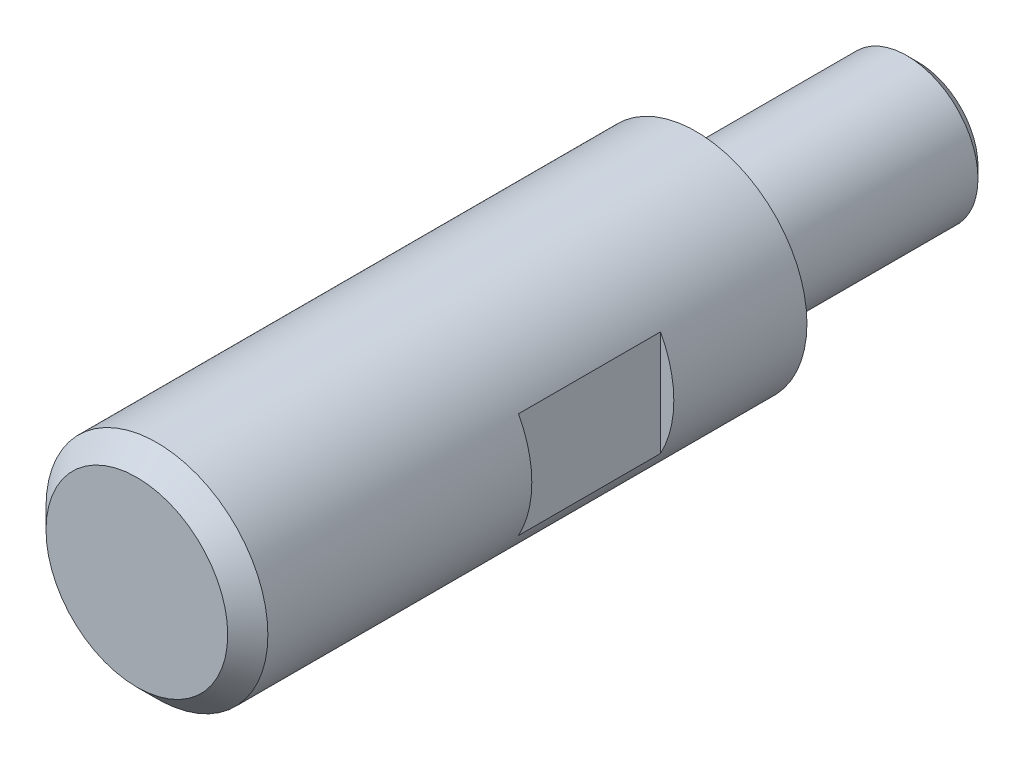
ISO-10303-21;
HEADER;
FILE_DESCRIPTION(('STEP AP214'),'2;1');
FILE_NAME('part.step','',(''),(''),'','','');
FILE_SCHEMA(('AUTOMOTIVE_DESIGN { 1 0 10303 214 1 1 1 1 }'));
ENDSEC;
DATA;
#1=APPLICATION_CONTEXT('core data for automotive mechanical design processes');
#2=APPLICATION_PROTOCOL_DEFINITION('international standard','automotive_design',2000,#1);
#3=PRODUCT_CONTEXT('',#1,'mechanical');
#4=PRODUCT('Part','Part','',(#3));
#5=PRODUCT_RELATED_PRODUCT_CATEGORY('part','',(#4));
#6=PRODUCT_DEFINITION_FORMATION('','',#4);
#7=PRODUCT_DEFINITION_CONTEXT('part definition',#1,'design');
#8=PRODUCT_DEFINITION('design','',#6,#7);
#9=PRODUCT_DEFINITION_SHAPE('','',#8);
#10=(LENGTH_UNIT() NAMED_UNIT(*) SI_UNIT(.MILLI.,.METRE.));
#11=(NAMED_UNIT(*) PLANE_ANGLE_UNIT() SI_UNIT($,.RADIAN.));
#12=(NAMED_UNIT(*) SI_UNIT($,.STERADIAN.) SOLID_ANGLE_UNIT());
#13=UNCERTAINTY_MEASURE_WITH_UNIT(LENGTH_MEASURE(1.E-05),#10,'distance_accuracy_value','');
#14=(GEOMETRIC_REPRESENTATION_CONTEXT(3) GLOBAL_UNCERTAINTY_ASSIGNED_CONTEXT((#13)) GLOBAL_UNIT_ASSIGNED_CONTEXT((#10,
#11,#12)) REPRESENTATION_CONTEXT('',''));
#15=CARTESIAN_POINT('',(0.,0.,0.));
#16=DIRECTION('',(0.,0.,1.));
#17=DIRECTION('',(1.,0.,0.));
#18=AXIS2_PLACEMENT_3D('',#15,#16,#17);
#19=CARTESIAN_POINT('',(0.,0.,25.));
#20=DIRECTION('',(0.,0.,1.));
#21=DIRECTION('',(1.,0.,0.));
#22=AXIS2_PLACEMENT_3D('',#19,#20,#21);
#23=CYLINDRICAL_SURFACE('',#22,12.5);
#24=DIRECTION('',(0.,0.,1.));
#25=VECTOR('',#24,1.);
#26=CARTESIAN_POINT('',(-11.,-5.9371710435184,25.));
#27=LINE('',#26,#25);
#28=CARTESIAN_POINT('',(-11.,-5.9371710435184,56.));
#29=VERTEX_POINT('',#28);
#30=CARTESIAN_POINT('',(-11.,-5.9371710435184,40.));
#31=VERTEX_POINT('',#30);
#32=EDGE_CURVE('E94',#29,#31,#27,.F.);
#33=ORIENTED_EDGE('',*,*,#32,.T.);
#34=CARTESIAN_POINT('',(0.,0.,40.));
#35=DIRECTION('',(0.,0.,-1.));
#36=DIRECTION('',(-1.,0.,0.));
#37=AXIS2_PLACEMENT_3D('',#34,#35,#36);
#38=CIRCLE('',#37,12.5);
#39=CARTESIAN_POINT('',(-10.9999999999987,5.93717104351957,40.));
#40=VERTEX_POINT('',#39);
#41=EDGE_CURVE('E13',#31,#40,#38,.T.);
#42=ORIENTED_EDGE('',*,*,#41,.T.);
#43=DIRECTION('',(0.,0.,1.));
#44=VECTOR('',#43,1.);
#45=CARTESIAN_POINT('',(-10.9999999999987,5.93717104351957,25.));
#46=LINE('',#45,#44);
#47=CARTESIAN_POINT('',(-10.9999999999987,5.93717104351957,56.));
#48=VERTEX_POINT('',#47);
#49=EDGE_CURVE('E58',#40,#48,#46,.T.);
#50=ORIENTED_EDGE('',*,*,#49,.T.);
#51=CARTESIAN_POINT('',(0.,0.,56.));
#52=DIRECTION('',(0.,0.,1.));
#53=DIRECTION('',(1.,0.,0.));
#54=AXIS2_PLACEMENT_3D('',#51,#52,#53);
#55=CIRCLE('',#54,12.5);
#56=EDGE_CURVE('E89',#48,#29,#55,.T.);
#57=ORIENTED_EDGE('',*,*,#56,.T.);
#58=EDGE_LOOP('',(#33,#42,#50,#57));
#59=FACE_BOUND('',#58,.T.);
#60=CARTESIAN_POINT('',(0.,0.,40.));
#61=DIRECTION('',(0.,0.,-1.));
#62=DIRECTION('',(-1.,0.,0.));
#63=AXIS2_PLACEMENT_3D('',#60,#61,#62);
#64=CIRCLE('',#63,12.5);
#65=CARTESIAN_POINT('',(11.0000000000013,5.93717104351957,40.));
#66=VERTEX_POINT('',#65);
#67=CARTESIAN_POINT('',(11.,-5.93717104351899,40.));
#68=VERTEX_POINT('',#67);
#69=EDGE_CURVE('E108',#66,#68,#64,.T.);
#70=ORIENTED_EDGE('',*,*,#69,.T.);
#71=DIRECTION('',(0.,0.,1.));
#72=VECTOR('',#71,1.);
#73=CARTESIAN_POINT('',(11.,-5.93717104351899,25.));
#74=LINE('',#73,#72);
#75=CARTESIAN_POINT('',(11.,-5.93717104351899,56.));
#76=VERTEX_POINT('',#75);
#77=EDGE_CURVE('E95',#68,#76,#74,.T.);
#78=ORIENTED_EDGE('',*,*,#77,.T.);
#79=CARTESIAN_POINT('',(0.,0.,56.));
#80=DIRECTION('',(0.,0.,1.));
#81=DIRECTION('',(1.,0.,0.));
#82=AXIS2_PLACEMENT_3D('',#79,#80,#81);
#83=CIRCLE('',#82,12.5);
#84=CARTESIAN_POINT('',(11.0000000000013,5.93717104351957,56.));
#85=VERTEX_POINT('',#84);
#86=EDGE_CURVE('E111',#76,#85,#83,.T.);
#87=ORIENTED_EDGE('',*,*,#86,.T.);
#88=DIRECTION('',(0.,0.,1.));
#89=VECTOR('',#88,1.);
#90=CARTESIAN_POINT('',(11.0000000000013,5.93717104351957,25.));
#91=LINE('',#90,#89);
#92=EDGE_CURVE('E114',#85,#66,#91,.F.);
#93=ORIENTED_EDGE('',*,*,#92,.T.);
#94=EDGE_LOOP('',(#70,#78,#87,#93));
#95=FACE_BOUND('',#94,.T.);
#96=CARTESIAN_POINT('',(0.,0.,25.));
#97=DIRECTION('',(0.,0.,1.));
#98=DIRECTION('',(1.,0.,0.));
#99=AXIS2_PLACEMENT_3D('',#96,#97,#98);
#100=CIRCLE('',#99,12.5);
#101=CARTESIAN_POINT('',(12.5,0.,25.));
#102=VERTEX_POINT('',#101);
#103=EDGE_CURVE('E123',#102,#102,#100,.T.);
#104=ORIENTED_EDGE('',*,*,#103,.T.);
#105=EDGE_LOOP('',(#104));
#106=FACE_BOUND('',#105,.T.);
#107=CARTESIAN_POINT('',(0.,0.,85.7372583002031));
#108=DIRECTION('',(0.,0.,1.));
#109=DIRECTION('',(1.,0.,0.));
#110=AXIS2_PLACEMENT_3D('',#107,#108,#109);
#111=CIRCLE('',#110,12.5);
#112=CARTESIAN_POINT('',(12.5,0.,85.7372583002031));
#113=VERTEX_POINT('',#112);
#114=EDGE_CURVE('E126',#113,#113,#111,.T.);
#115=ORIENTED_EDGE('',*,*,#114,.F.);
#116=EDGE_LOOP('',(#115));
#117=FACE_BOUND('',#116,.T.);
#118=ADVANCED_FACE('F50',(#59,#95,#106,#117),#23,.T.);
#119=CARTESIAN_POINT('',(1.33226762955019E-12,12.5,25.));
#120=DIRECTION('',(0.,0.,1.));
#121=DIRECTION('',(1.,0.,0.));
#122=AXIS2_PLACEMENT_3D('',#119,#120,#121);
#123=PLANE('',#122);
#124=ORIENTED_EDGE('',*,*,#103,.F.);
#125=EDGE_LOOP('',(#124));
#126=FACE_BOUND('',#125,.T.);
#127=CARTESIAN_POINT('',(0.,0.,25.));
#128=DIRECTION('',(0.,0.,1.));
#129=DIRECTION('',(1.,0.,0.));
#130=AXIS2_PLACEMENT_3D('',#127,#128,#129);
#131=CIRCLE('',#130,8.);
#132=CARTESIAN_POINT('',(8.,0.,25.));
#133=VERTEX_POINT('',#132);
#134=EDGE_CURVE('E135',#133,#133,#131,.T.);
#135=ORIENTED_EDGE('',*,*,#134,.T.);
#136=EDGE_LOOP('',(#135));
#137=FACE_BOUND('',#136,.T.);
#138=ADVANCED_FACE('F157',(#126,#137),#123,.F.);
#139=CARTESIAN_POINT('',(0.,0.,88.));
#140=DIRECTION('',(0.,0.,-1.));
#141=DIRECTION('',(-1.,0.,0.));
#142=AXIS2_PLACEMENT_3D('',#139,#140,#141);
#143=CONICAL_SURFACE('',#142,10.2372583002031,0.785398163397449);
#144=ORIENTED_EDGE('',*,*,#114,.T.);
#145=EDGE_LOOP('',(#144));
#146=FACE_BOUND('',#145,.T.);
#147=CARTESIAN_POINT('',(0.,0.,88.));
#148=DIRECTION('',(0.,0.,1.));
#149=DIRECTION('',(1.,0.,0.));
#150=AXIS2_PLACEMENT_3D('',#147,#148,#149);
#151=CIRCLE('',#150,10.2372583002031);
#152=CARTESIAN_POINT('',(10.2372583002031,0.,88.));
#153=VERTEX_POINT('',#152);
#154=EDGE_CURVE('E129',#153,#153,#151,.T.);
#155=ORIENTED_EDGE('',*,*,#154,.F.);
#156=EDGE_LOOP('',(#155));
#157=FACE_BOUND('',#156,.T.);
#158=ADVANCED_FACE('F162',(#146,#157),#143,.T.);
#159=CARTESIAN_POINT('',(0.,0.,88.));
#160=DIRECTION('',(0.,0.,-1.));
#161=DIRECTION('',(-1.,0.,0.));
#162=AXIS2_PLACEMENT_3D('',#159,#160,#161);
#163=PLANE('',#162);
#164=ORIENTED_EDGE('',*,*,#154,.T.);
#165=EDGE_LOOP('',(#164));
#166=FACE_BOUND('',#165,.T.);
#167=ADVANCED_FACE('F167',(#166),#163,.F.);
#168=CARTESIAN_POINT('',(0.,0.,24.2));
#169=DIRECTION('',(0.,0.,1.));
#170=DIRECTION('',(1.,0.,0.));
#171=AXIS2_PLACEMENT_3D('',#168,#169,#170);
#172=TOROIDAL_SURFACE('',#171,8.,0.800000000000004);
#173=CARTESIAN_POINT('',(0.,0.,23.4));
#174=DIRECTION('',(0.,0.,1.));
#175=DIRECTION('',(1.,0.,0.));
#176=AXIS2_PLACEMENT_3D('',#173,#174,#175);
#177=CIRCLE('',#176,8.);
#178=CARTESIAN_POINT('',(8.,0.,23.4));
#179=VERTEX_POINT('',#178);
#180=EDGE_CURVE('E132',#179,#179,#177,.T.);
#181=ORIENTED_EDGE('',*,*,#180,.T.);
#182=EDGE_LOOP('',(#181));
#183=FACE_BOUND('',#182,.T.);
#184=ORIENTED_EDGE('',*,*,#134,.F.);
#185=EDGE_LOOP('',(#184));
#186=FACE_BOUND('',#185,.T.);
#187=ADVANCED_FACE('F170',(#183,#186),#172,.F.);
#188=CARTESIAN_POINT('',(0.,6.77300000000003,0.));
#189=DIRECTION('',(0.,0.,1.));
#190=DIRECTION('',(1.,0.,0.));
#191=AXIS2_PLACEMENT_3D('',#188,#189,#190);
#192=PLANE('',#191);
#193=CARTESIAN_POINT('',(0.,0.,0.));
#194=DIRECTION('',(0.,0.,1.));
#195=DIRECTION('',(1.,0.,0.));
#196=AXIS2_PLACEMENT_3D('',#193,#194,#195);
#197=CIRCLE('',#196,6.773);
#198=CARTESIAN_POINT('',(6.773,0.,0.));
#199=VERTEX_POINT('',#198);
#200=EDGE_CURVE('E120',#199,#199,#197,.T.);
#201=ORIENTED_EDGE('',*,*,#200,.F.);
#202=EDGE_LOOP('',(#201));
#203=FACE_BOUND('',#202,.T.);
#204=ADVANCED_FACE('F172',(#203),#192,.F.);
#205=CARTESIAN_POINT('',(0.,0.,0.));
#206=DIRECTION('',(0.,0.,1.));
#207=DIRECTION('',(1.,0.,0.));
#208=AXIS2_PLACEMENT_3D('',#205,#206,#207);
#209=CONICAL_SURFACE('',#208,6.773,0.785398163397448);
#210=CARTESIAN_POINT('',(0.,0.,1.22699999999998));
#211=DIRECTION('',(0.,0.,1.));
#212=DIRECTION('',(1.,0.,0.));
#213=AXIS2_PLACEMENT_3D('',#210,#211,#212);
#214=CIRCLE('',#213,8.);
#215=CARTESIAN_POINT('',(8.,0.,1.22699999999998));
#216=VERTEX_POINT('',#215);
#217=EDGE_CURVE('E117',#216,#216,#214,.T.);
#218=ORIENTED_EDGE('',*,*,#217,.F.);
#219=EDGE_LOOP('',(#218));
#220=FACE_BOUND('',#219,.T.);
#221=ORIENTED_EDGE('',*,*,#200,.T.);
#222=EDGE_LOOP('',(#221));
#223=FACE_BOUND('',#222,.T.);
#224=ADVANCED_FACE('F174',(#220,#223),#209,.T.);
#225=CARTESIAN_POINT('',(0.,0.,0.));
#226=DIRECTION('',(0.,0.,1.));
#227=DIRECTION('',(1.,0.,0.));
#228=AXIS2_PLACEMENT_3D('',#225,#226,#227);
#229=CYLINDRICAL_SURFACE('',#228,8.);
#230=ORIENTED_EDGE('',*,*,#217,.T.);
#231=EDGE_LOOP('',(#230));
#232=FACE_BOUND('',#231,.T.);
#233=ORIENTED_EDGE('',*,*,#180,.F.);
#234=EDGE_LOOP('',(#233));
#235=FACE_BOUND('',#234,.T.);
#236=ADVANCED_FACE('F52',(#232,#235),#229,.T.);
#237=CARTESIAN_POINT('',(14.9999999999987,-12.5,40.));
#238=DIRECTION('',(0.,0.,-1.));
#239=DIRECTION('',(-1.,0.,0.));
#240=AXIS2_PLACEMENT_3D('',#237,#238,#239);
#241=PLANE('',#240);
#242=DIRECTION('',(0.,1.,0.));
#243=VECTOR('',#242,1.);
#244=CARTESIAN_POINT('',(10.9999999999987,-12.5,40.));
#245=LINE('',#244,#243);
#246=EDGE_CURVE('E72',#68,#66,#245,.T.);
#247=ORIENTED_EDGE('',*,*,#246,.F.);
#248=ORIENTED_EDGE('',*,*,#69,.F.);
#249=EDGE_LOOP('',(#247,#248));
#250=FACE_BOUND('',#249,.T.);
#251=ADVANCED_FACE('F181',(#250),#241,.F.);
#252=CARTESIAN_POINT('',(10.9999999999987,-12.5,56.));
#253=DIRECTION('',(0.,0.,1.));
#254=DIRECTION('',(1.,0.,0.));
#255=AXIS2_PLACEMENT_3D('',#252,#253,#254);
#256=PLANE('',#255);
#257=DIRECTION('',(0.,1.,0.));
#258=VECTOR('',#257,1.);
#259=CARTESIAN_POINT('',(10.9999999999987,-12.5,56.));
#260=LINE('',#259,#258);
#261=EDGE_CURVE('E138',#76,#85,#260,.T.);
#262=ORIENTED_EDGE('',*,*,#261,.T.);
#263=ORIENTED_EDGE('',*,*,#86,.F.);
#264=EDGE_LOOP('',(#262,#263));
#265=FACE_BOUND('',#264,.T.);
#266=ADVANCED_FACE('F152',(#265),#256,.F.);
#267=CARTESIAN_POINT('',(10.9999999999987,-12.5,40.));
#268=DIRECTION('',(-1.,0.,0.));
#269=DIRECTION('',(0.,0.,1.));
#270=AXIS2_PLACEMENT_3D('',#267,#268,#269);
#271=PLANE('',#270);
#272=ORIENTED_EDGE('',*,*,#246,.T.);
#273=ORIENTED_EDGE('',*,*,#92,.F.);
#274=ORIENTED_EDGE('',*,*,#261,.F.);
#275=ORIENTED_EDGE('',*,*,#77,.F.);
#276=EDGE_LOOP('',(#272,#273,#274,#275));
#277=FACE_BOUND('',#276,.T.);
#278=ADVANCED_FACE('F145',(#277),#271,.F.);
#279=CARTESIAN_POINT('',(-11.0000000000013,-12.4999999999995,40.));
#280=DIRECTION('',(0.,0.,-1.));
#281=DIRECTION('',(-1.,0.,0.));
#282=AXIS2_PLACEMENT_3D('',#279,#280,#281);
#283=PLANE('',#282);
#284=DIRECTION('',(0.,1.,0.));
#285=VECTOR('',#284,1.);
#286=CARTESIAN_POINT('',(-11.0000000000013,-12.4999999999995,40.));
#287=LINE('',#286,#285);
#288=EDGE_CURVE('E101',#31,#40,#287,.T.);
#289=ORIENTED_EDGE('',*,*,#288,.T.);
#290=ORIENTED_EDGE('',*,*,#41,.F.);
#291=EDGE_LOOP('',(#289,#290));
#292=FACE_BOUND('',#291,.T.);
#293=ADVANCED_FACE('F143',(#292),#283,.F.);
#294=CARTESIAN_POINT('',(-11.0000000000013,-12.4999999999995,56.));
#295=DIRECTION('',(1.,0.,0.));
#296=DIRECTION('',(0.,0.,-1.));
#297=AXIS2_PLACEMENT_3D('',#294,#295,#296);
#298=PLANE('',#297);
#299=ORIENTED_EDGE('',*,*,#288,.F.);
#300=ORIENTED_EDGE('',*,*,#32,.F.);
#301=DIRECTION('',(0.,1.,0.));
#302=VECTOR('',#301,1.);
#303=CARTESIAN_POINT('',(-11.0000000000013,-12.4999999999995,56.));
#304=LINE('',#303,#302);
#305=EDGE_CURVE('E64',#29,#48,#304,.T.);
#306=ORIENTED_EDGE('',*,*,#305,.T.);
#307=ORIENTED_EDGE('',*,*,#49,.F.);
#308=EDGE_LOOP('',(#299,#300,#306,#307));
#309=FACE_BOUND('',#308,.T.);
#310=ADVANCED_FACE('F99',(#309),#298,.F.);
#311=CARTESIAN_POINT('',(-15.0000000000013,-12.5,56.));
#312=DIRECTION('',(0.,0.,1.));
#313=DIRECTION('',(1.,0.,0.));
#314=AXIS2_PLACEMENT_3D('',#311,#312,#313);
#315=PLANE('',#314);
#316=ORIENTED_EDGE('',*,*,#305,.F.);
#317=ORIENTED_EDGE('',*,*,#56,.F.);
#318=EDGE_LOOP('',(#316,#317));
#319=FACE_BOUND('',#318,.T.);
#320=ADVANCED_FACE('F90',(#319),#315,.F.);
#321=CLOSED_SHELL('',(#118,#138,#158,#167,#187,#204,#224,#236,#251,#266,#278,#293,#310,#320));
#322=MANIFOLD_SOLID_BREP('B2',#321);
#323=ADVANCED_BREP_SHAPE_REPRESENTATION('',(#18,#322),#14);
#324=SHAPE_DEFINITION_REPRESENTATION(#9,#323);
ENDSEC;
END-ISO-10303-21;
